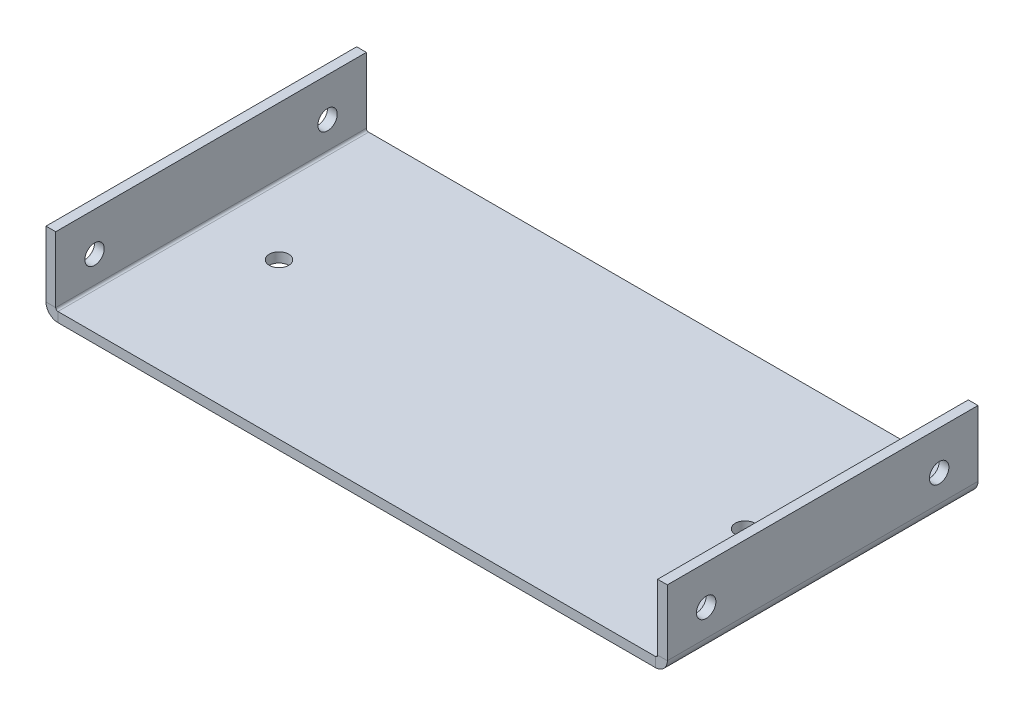
ISO-10303-21;
HEADER;
FILE_DESCRIPTION(('STEP AP214'),'2;1');
FILE_NAME('part.step','',(''),(''),'','','');
FILE_SCHEMA(('AUTOMOTIVE_DESIGN { 1 0 10303 214 1 1 1 1 }'));
ENDSEC;
DATA;
#1=APPLICATION_CONTEXT('core data for automotive mechanical design processes');
#2=APPLICATION_PROTOCOL_DEFINITION('international standard','automotive_design',2000,#1);
#3=PRODUCT_CONTEXT('',#1,'mechanical');
#4=PRODUCT('Part','Part','',(#3));
#5=PRODUCT_RELATED_PRODUCT_CATEGORY('part','',(#4));
#6=PRODUCT_DEFINITION_FORMATION('','',#4);
#7=PRODUCT_DEFINITION_CONTEXT('part definition',#1,'design');
#8=PRODUCT_DEFINITION('design','',#6,#7);
#9=PRODUCT_DEFINITION_SHAPE('','',#8);
#10=(LENGTH_UNIT() NAMED_UNIT(*) SI_UNIT(.MILLI.,.METRE.));
#11=(NAMED_UNIT(*) PLANE_ANGLE_UNIT() SI_UNIT($,.RADIAN.));
#12=(NAMED_UNIT(*) SI_UNIT($,.STERADIAN.) SOLID_ANGLE_UNIT());
#13=UNCERTAINTY_MEASURE_WITH_UNIT(LENGTH_MEASURE(1.E-05),#10,'distance_accuracy_value','');
#14=(GEOMETRIC_REPRESENTATION_CONTEXT(3) GLOBAL_UNCERTAINTY_ASSIGNED_CONTEXT((#13)) GLOBAL_UNIT_ASSIGNED_CONTEXT((#10,
#11,#12)) REPRESENTATION_CONTEXT('',''));
#15=CARTESIAN_POINT('',(0.,0.,0.));
#16=DIRECTION('',(0.,0.,1.));
#17=DIRECTION('',(1.,0.,0.));
#18=AXIS2_PLACEMENT_3D('',#15,#16,#17);
#19=CARTESIAN_POINT('',(0.,3.175,101.6));
#20=DIRECTION('',(0.,-1.,0.));
#21=DIRECTION('',(0.,0.,-1.));
#22=AXIS2_PLACEMENT_3D('',#19,#20,#21);
#23=PLANE('',#22);
#24=CARTESIAN_POINT('',(-25.3999999999999,3.175,50.8));
#25=DIRECTION('',(0.,1.,0.));
#26=DIRECTION('',(0.,0.,1.));
#27=AXIS2_PLACEMENT_3D('',#24,#25,#26);
#28=CIRCLE('',#27,3.175);
#29=CARTESIAN_POINT('',(-25.3999999999999,3.175,53.975));
#30=VERTEX_POINT('',#29);
#31=EDGE_CURVE('E310',#30,#30,#28,.T.);
#32=ORIENTED_EDGE('',*,*,#31,.F.);
#33=EDGE_LOOP('',(#32));
#34=FACE_BOUND('',#33,.T.);
#35=CARTESIAN_POINT('',(-177.8,3.175,50.8));
#36=DIRECTION('',(0.,1.,0.));
#37=DIRECTION('',(0.,0.,1.));
#38=AXIS2_PLACEMENT_3D('',#35,#36,#37);
#39=CIRCLE('',#38,3.175);
#40=CARTESIAN_POINT('',(-177.8,3.175,53.975));
#41=VERTEX_POINT('',#40);
#42=EDGE_CURVE('E300',#41,#41,#39,.T.);
#43=ORIENTED_EDGE('',*,*,#42,.F.);
#44=EDGE_LOOP('',(#43));
#45=FACE_BOUND('',#44,.T.);
#46=DIRECTION('',(0.,0.,-1.));
#47=VECTOR('',#46,1.);
#48=CARTESIAN_POINT('',(-3.9116,3.175,0.));
#49=LINE('',#48,#47);
#50=CARTESIAN_POINT('',(-3.9116,3.175,0.));
#51=VERTEX_POINT('',#50);
#52=CARTESIAN_POINT('',(-3.9116,3.175,101.6));
#53=VERTEX_POINT('',#52);
#54=EDGE_CURVE('E223',#51,#53,#49,.F.);
#55=ORIENTED_EDGE('',*,*,#54,.F.);
#56=DIRECTION('',(1.,0.,0.));
#57=VECTOR('',#56,1.);
#58=CARTESIAN_POINT('',(0.,3.175,0.));
#59=LINE('',#58,#57);
#60=CARTESIAN_POINT('',(-199.2884,3.17500000000001,0.));
#61=VERTEX_POINT('',#60);
#62=EDGE_CURVE('E283',#51,#61,#59,.F.);
#63=ORIENTED_EDGE('',*,*,#62,.T.);
#64=DIRECTION('',(0.,0.,1.));
#65=VECTOR('',#64,1.);
#66=CARTESIAN_POINT('',(-199.2884,3.17500000000001,101.6));
#67=LINE('',#66,#65);
#68=CARTESIAN_POINT('',(-199.2884,3.17500000000001,101.6));
#69=VERTEX_POINT('',#68);
#70=EDGE_CURVE('E275',#69,#61,#67,.F.);
#71=ORIENTED_EDGE('',*,*,#70,.F.);
#72=DIRECTION('',(1.,0.,0.));
#73=VECTOR('',#72,1.);
#74=CARTESIAN_POINT('',(0.,3.175,101.6));
#75=LINE('',#74,#73);
#76=EDGE_CURVE('E87',#53,#69,#75,.F.);
#77=ORIENTED_EDGE('',*,*,#76,.F.);
#78=EDGE_LOOP('',(#55,#63,#71,#77));
#79=FACE_BOUND('',#78,.T.);
#80=ADVANCED_FACE('F79',(#34,#45,#79),#23,.F.);
#81=CARTESIAN_POINT('',(0.,0.,101.6));
#82=DIRECTION('',(0.,-1.,0.));
#83=DIRECTION('',(0.,0.,-1.));
#84=AXIS2_PLACEMENT_3D('',#81,#82,#83);
#85=PLANE('',#84);
#86=CARTESIAN_POINT('',(-25.3999999999999,0.,50.8));
#87=DIRECTION('',(0.,-1.,0.));
#88=DIRECTION('',(0.,0.,-1.));
#89=AXIS2_PLACEMENT_3D('',#86,#87,#88);
#90=CIRCLE('',#89,3.175);
#91=CARTESIAN_POINT('',(-25.3999999999999,0.,47.625));
#92=VERTEX_POINT('',#91);
#93=EDGE_CURVE('E82',#92,#92,#90,.T.);
#94=ORIENTED_EDGE('',*,*,#93,.F.);
#95=EDGE_LOOP('',(#94));
#96=FACE_BOUND('',#95,.T.);
#97=CARTESIAN_POINT('',(-177.8,0.,50.8));
#98=DIRECTION('',(0.,-1.,0.));
#99=DIRECTION('',(0.,0.,-1.));
#100=AXIS2_PLACEMENT_3D('',#97,#98,#99);
#101=CIRCLE('',#100,3.175);
#102=CARTESIAN_POINT('',(-177.8,0.,47.625));
#103=VERTEX_POINT('',#102);
#104=EDGE_CURVE('E297',#103,#103,#101,.T.);
#105=ORIENTED_EDGE('',*,*,#104,.F.);
#106=EDGE_LOOP('',(#105));
#107=FACE_BOUND('',#106,.T.);
#108=DIRECTION('',(-1.,0.,0.));
#109=VECTOR('',#108,1.);
#110=CARTESIAN_POINT('',(0.,0.,0.));
#111=LINE('',#110,#109);
#112=CARTESIAN_POINT('',(-3.9116,0.,0.));
#113=VERTEX_POINT('',#112);
#114=CARTESIAN_POINT('',(-199.2884,0.,0.));
#115=VERTEX_POINT('',#114);
#116=EDGE_CURVE('E103',#113,#115,#111,.T.);
#117=ORIENTED_EDGE('',*,*,#116,.F.);
#118=DIRECTION('',(0.,0.,-1.));
#119=VECTOR('',#118,1.);
#120=CARTESIAN_POINT('',(-3.9116,0.,0.));
#121=LINE('',#120,#119);
#122=CARTESIAN_POINT('',(-3.9116,0.,101.6));
#123=VERTEX_POINT('',#122);
#124=EDGE_CURVE('E212',#113,#123,#121,.F.);
#125=ORIENTED_EDGE('',*,*,#124,.T.);
#126=DIRECTION('',(-1.,0.,0.));
#127=VECTOR('',#126,1.);
#128=CARTESIAN_POINT('',(0.,0.,101.6));
#129=LINE('',#128,#127);
#130=CARTESIAN_POINT('',(-199.2884,0.,101.6));
#131=VERTEX_POINT('',#130);
#132=EDGE_CURVE('E13',#123,#131,#129,.T.);
#133=ORIENTED_EDGE('',*,*,#132,.T.);
#134=DIRECTION('',(0.,0.,1.));
#135=VECTOR('',#134,1.);
#136=CARTESIAN_POINT('',(-199.2884,0.,101.6));
#137=LINE('',#136,#135);
#138=EDGE_CURVE('E262',#131,#115,#137,.F.);
#139=ORIENTED_EDGE('',*,*,#138,.T.);
#140=EDGE_LOOP('',(#117,#125,#133,#139));
#141=FACE_BOUND('',#140,.T.);
#142=ADVANCED_FACE('F349',(#96,#107,#141),#85,.T.);
#143=CARTESIAN_POINT('',(0.,0.,0.));
#144=DIRECTION('',(0.,0.,1.));
#145=DIRECTION('',(1.,0.,0.));
#146=AXIS2_PLACEMENT_3D('',#143,#144,#145);
#147=PLANE('',#146);
#148=DIRECTION('',(0.,-1.,0.));
#149=VECTOR('',#148,1.);
#150=CARTESIAN_POINT('',(-3.9116,3.175,0.));
#151=LINE('',#150,#149);
#152=EDGE_CURVE('E217',#51,#113,#151,.T.);
#153=ORIENTED_EDGE('',*,*,#152,.T.);
#154=ORIENTED_EDGE('',*,*,#116,.T.);
#155=DIRECTION('',(0.,-1.,0.));
#156=VECTOR('',#155,1.);
#157=CARTESIAN_POINT('',(-199.2884,3.17500000000001,0.));
#158=LINE('',#157,#156);
#159=EDGE_CURVE('E280',#61,#115,#158,.T.);
#160=ORIENTED_EDGE('',*,*,#159,.F.);
#161=ORIENTED_EDGE('',*,*,#62,.F.);
#162=EDGE_LOOP('',(#153,#154,#160,#161));
#163=FACE_BOUND('',#162,.T.);
#164=ADVANCED_FACE('F354',(#163),#147,.F.);
#165=CARTESIAN_POINT('',(0.,0.,101.6));
#166=DIRECTION('',(0.,0.,1.));
#167=DIRECTION('',(1.,0.,0.));
#168=AXIS2_PLACEMENT_3D('',#165,#166,#167);
#169=PLANE('',#168);
#170=DIRECTION('',(0.,-1.,0.));
#171=VECTOR('',#170,1.);
#172=CARTESIAN_POINT('',(-3.9116,3.175,101.6));
#173=LINE('',#172,#171);
#174=EDGE_CURVE('E228',#53,#123,#173,.T.);
#175=ORIENTED_EDGE('',*,*,#174,.F.);
#176=ORIENTED_EDGE('',*,*,#76,.T.);
#177=DIRECTION('',(0.,-1.,0.));
#178=VECTOR('',#177,1.);
#179=CARTESIAN_POINT('',(-199.2884,3.17500000000001,101.6));
#180=LINE('',#179,#178);
#181=EDGE_CURVE('E269',#69,#131,#180,.T.);
#182=ORIENTED_EDGE('',*,*,#181,.T.);
#183=ORIENTED_EDGE('',*,*,#132,.F.);
#184=EDGE_LOOP('',(#175,#176,#182,#183));
#185=FACE_BOUND('',#184,.T.);
#186=ADVANCED_FACE('F368',(#185),#169,.T.);
#187=CARTESIAN_POINT('',(-199.2884,3.91160000000002,0.));
#188=DIRECTION('',(0.,0.,-1.));
#189=DIRECTION('',(-1.,0.,0.));
#190=AXIS2_PLACEMENT_3D('',#187,#188,#189);
#191=PLANE('',#190);
#192=DIRECTION('',(1.,0.,0.));
#193=VECTOR('',#192,1.);
#194=CARTESIAN_POINT('',(-203.2,3.9116,0.));
#195=LINE('',#194,#193);
#196=CARTESIAN_POINT('',(-200.025,3.91160000000002,0.));
#197=VERTEX_POINT('',#196);
#198=CARTESIAN_POINT('',(-203.2,3.9116,0.));
#199=VERTEX_POINT('',#198);
#200=EDGE_CURVE('E230',#197,#199,#195,.F.);
#201=ORIENTED_EDGE('',*,*,#200,.F.);
#202=CARTESIAN_POINT('',(-199.2884,3.91160000000002,0.));
#203=DIRECTION('',(0.,0.,1.));
#204=DIRECTION('',(1.,0.,0.));
#205=AXIS2_PLACEMENT_3D('',#202,#203,#204);
#206=CIRCLE('',#205,0.736600000000004);
#207=EDGE_CURVE('E272',#61,#197,#206,.F.);
#208=ORIENTED_EDGE('',*,*,#207,.F.);
#209=ORIENTED_EDGE('',*,*,#159,.T.);
#210=CARTESIAN_POINT('',(-199.2884,3.91160000000002,0.));
#211=DIRECTION('',(0.,0.,1.));
#212=DIRECTION('',(1.,0.,0.));
#213=AXIS2_PLACEMENT_3D('',#210,#211,#212);
#214=CIRCLE('',#213,3.9116);
#215=EDGE_CURVE('E265',#115,#199,#214,.F.);
#216=ORIENTED_EDGE('',*,*,#215,.T.);
#217=EDGE_LOOP('',(#201,#208,#209,#216));
#218=FACE_BOUND('',#217,.T.);
#219=ADVANCED_FACE('F397',(#218),#191,.T.);
#220=CARTESIAN_POINT('',(-199.2884,3.91160000000002,101.6));
#221=DIRECTION('',(0.,0.,-1.));
#222=DIRECTION('',(-1.,0.,0.));
#223=AXIS2_PLACEMENT_3D('',#220,#221,#222);
#224=PLANE('',#223);
#225=CARTESIAN_POINT('',(-199.2884,3.91160000000002,101.6));
#226=DIRECTION('',(0.,0.,1.));
#227=DIRECTION('',(1.,0.,0.));
#228=AXIS2_PLACEMENT_3D('',#225,#226,#227);
#229=CIRCLE('',#228,0.736600000000004);
#230=CARTESIAN_POINT('',(-200.025,3.91160000000002,101.6));
#231=VERTEX_POINT('',#230);
#232=EDGE_CURVE('E235',#231,#69,#229,.T.);
#233=ORIENTED_EDGE('',*,*,#232,.F.);
#234=DIRECTION('',(1.,0.,0.));
#235=VECTOR('',#234,1.);
#236=CARTESIAN_POINT('',(-200.025,3.91160000000002,101.6));
#237=LINE('',#236,#235);
#238=CARTESIAN_POINT('',(-203.2,3.9116,101.6));
#239=VERTEX_POINT('',#238);
#240=EDGE_CURVE('E255',#231,#239,#237,.F.);
#241=ORIENTED_EDGE('',*,*,#240,.T.);
#242=CARTESIAN_POINT('',(-199.2884,3.91160000000002,101.6));
#243=DIRECTION('',(0.,0.,1.));
#244=DIRECTION('',(1.,0.,0.));
#245=AXIS2_PLACEMENT_3D('',#242,#243,#244);
#246=CIRCLE('',#245,3.9116);
#247=EDGE_CURVE('E266',#239,#131,#246,.T.);
#248=ORIENTED_EDGE('',*,*,#247,.T.);
#249=ORIENTED_EDGE('',*,*,#181,.F.);
#250=EDGE_LOOP('',(#233,#241,#248,#249));
#251=FACE_BOUND('',#250,.T.);
#252=ADVANCED_FACE('F376',(#251),#224,.F.);
#253=CARTESIAN_POINT('',(-199.2884,3.91160000000002,101.6));
#254=DIRECTION('',(0.,0.,1.));
#255=DIRECTION('',(-1.,0.,0.));
#256=AXIS2_PLACEMENT_3D('',#253,#254,#255);
#257=CYLINDRICAL_SURFACE('',#256,3.9116);
#258=ORIENTED_EDGE('',*,*,#138,.F.);
#259=ORIENTED_EDGE('',*,*,#247,.F.);
#260=DIRECTION('',(0.,0.,1.));
#261=VECTOR('',#260,1.);
#262=CARTESIAN_POINT('',(-203.2,3.9116,0.));
#263=LINE('',#262,#261);
#264=EDGE_CURVE('E253',#239,#199,#263,.F.);
#265=ORIENTED_EDGE('',*,*,#264,.T.);
#266=ORIENTED_EDGE('',*,*,#215,.F.);
#267=EDGE_LOOP('',(#258,#259,#265,#266));
#268=FACE_BOUND('',#267,.T.);
#269=ADVANCED_FACE('F373',(#268),#257,.T.);
#270=CARTESIAN_POINT('',(-199.2884,3.91160000000002,101.6));
#271=DIRECTION('',(0.,0.,1.));
#272=DIRECTION('',(-1.,0.,0.));
#273=AXIS2_PLACEMENT_3D('',#270,#271,#272);
#274=CYLINDRICAL_SURFACE('',#273,0.736600000000004);
#275=ORIENTED_EDGE('',*,*,#70,.T.);
#276=ORIENTED_EDGE('',*,*,#207,.T.);
#277=DIRECTION('',(0.,0.,1.));
#278=VECTOR('',#277,1.);
#279=CARTESIAN_POINT('',(-200.025,3.91160000000002,0.));
#280=LINE('',#279,#278);
#281=EDGE_CURVE('E258',#197,#231,#280,.T.);
#282=ORIENTED_EDGE('',*,*,#281,.T.);
#283=ORIENTED_EDGE('',*,*,#232,.T.);
#284=EDGE_LOOP('',(#275,#276,#282,#283));
#285=FACE_BOUND('',#284,.T.);
#286=ADVANCED_FACE('F400',(#285),#274,.F.);
#287=CARTESIAN_POINT('',(-203.2,25.4,101.6));
#288=DIRECTION('',(0.,0.,-1.));
#289=DIRECTION('',(-1.,0.,0.));
#290=AXIS2_PLACEMENT_3D('',#287,#288,#289);
#291=PLANE('',#290);
#292=ORIENTED_EDGE('',*,*,#240,.F.);
#293=DIRECTION('',(0.,-1.,0.));
#294=VECTOR('',#293,1.);
#295=CARTESIAN_POINT('',(-200.025,25.4,101.6));
#296=LINE('',#295,#294);
#297=CARTESIAN_POINT('',(-200.025,25.4,101.6));
#298=VERTEX_POINT('',#297);
#299=EDGE_CURVE('E251',#231,#298,#296,.F.);
#300=ORIENTED_EDGE('',*,*,#299,.T.);
#301=DIRECTION('',(1.,0.,0.));
#302=VECTOR('',#301,1.);
#303=CARTESIAN_POINT('',(-203.2,25.4,101.6));
#304=LINE('',#303,#302);
#305=CARTESIAN_POINT('',(-203.2,25.4,101.6));
#306=VERTEX_POINT('',#305);
#307=EDGE_CURVE('E232',#306,#298,#304,.T.);
#308=ORIENTED_EDGE('',*,*,#307,.F.);
#309=DIRECTION('',(0.,1.,0.));
#310=VECTOR('',#309,1.);
#311=CARTESIAN_POINT('',(-203.2,-7.7238124156522E-13,101.6));
#312=LINE('',#311,#310);
#313=EDGE_CURVE('E244',#239,#306,#312,.T.);
#314=ORIENTED_EDGE('',*,*,#313,.F.);
#315=EDGE_LOOP('',(#292,#300,#308,#314));
#316=FACE_BOUND('',#315,.T.);
#317=ADVANCED_FACE('F386',(#316),#291,.F.);
#318=CARTESIAN_POINT('',(-203.2,3.17499999999999,0.));
#319=DIRECTION('',(0.,0.,1.));
#320=DIRECTION('',(1.,0.,0.));
#321=AXIS2_PLACEMENT_3D('',#318,#319,#320);
#322=PLANE('',#321);
#323=ORIENTED_EDGE('',*,*,#200,.T.);
#324=DIRECTION('',(0.,-1.,0.));
#325=VECTOR('',#324,1.);
#326=CARTESIAN_POINT('',(-203.2,-7.7238124156522E-13,0.));
#327=LINE('',#326,#325);
#328=CARTESIAN_POINT('',(-203.2,25.4,0.));
#329=VERTEX_POINT('',#328);
#330=EDGE_CURVE('E239',#329,#199,#327,.T.);
#331=ORIENTED_EDGE('',*,*,#330,.F.);
#332=DIRECTION('',(1.,0.,0.));
#333=VECTOR('',#332,1.);
#334=CARTESIAN_POINT('',(-203.2,25.4,0.));
#335=LINE('',#334,#333);
#336=CARTESIAN_POINT('',(-200.025,25.4,0.));
#337=VERTEX_POINT('',#336);
#338=EDGE_CURVE('E236',#329,#337,#335,.T.);
#339=ORIENTED_EDGE('',*,*,#338,.T.);
#340=DIRECTION('',(0.,1.,0.));
#341=VECTOR('',#340,1.);
#342=CARTESIAN_POINT('',(-200.025,3.175,0.));
#343=LINE('',#342,#341);
#344=EDGE_CURVE('E246',#337,#197,#343,.F.);
#345=ORIENTED_EDGE('',*,*,#344,.T.);
#346=EDGE_LOOP('',(#323,#331,#339,#345));
#347=FACE_BOUND('',#346,.T.);
#348=ADVANCED_FACE('F394',(#347),#322,.F.);
#349=CARTESIAN_POINT('',(-203.2,-7.7238124156522E-13,0.));
#350=DIRECTION('',(1.,0.,0.));
#351=DIRECTION('',(0.,1.,0.));
#352=AXIS2_PLACEMENT_3D('',#349,#350,#351);
#353=PLANE('',#352);
#354=CARTESIAN_POINT('',(-203.2,12.7000000000007,88.9));
#355=DIRECTION('',(1.,0.,0.));
#356=DIRECTION('',(0.,1.,0.));
#357=AXIS2_PLACEMENT_3D('',#354,#355,#356);
#358=CIRCLE('',#357,3.175);
#359=CARTESIAN_POINT('',(-203.2,15.8750000000007,88.9));
#360=VERTEX_POINT('',#359);
#361=EDGE_CURVE('E296',#360,#360,#358,.T.);
#362=ORIENTED_EDGE('',*,*,#361,.T.);
#363=EDGE_LOOP('',(#362));
#364=FACE_BOUND('',#363,.T.);
#365=CARTESIAN_POINT('',(-203.2,12.7000000000007,12.7));
#366=DIRECTION('',(1.,0.,0.));
#367=DIRECTION('',(0.,1.,0.));
#368=AXIS2_PLACEMENT_3D('',#365,#366,#367);
#369=CIRCLE('',#368,3.175);
#370=CARTESIAN_POINT('',(-203.2,15.8750000000007,12.7));
#371=VERTEX_POINT('',#370);
#372=EDGE_CURVE('E292',#371,#371,#369,.T.);
#373=ORIENTED_EDGE('',*,*,#372,.T.);
#374=EDGE_LOOP('',(#373));
#375=FACE_BOUND('',#374,.T.);
#376=ORIENTED_EDGE('',*,*,#264,.F.);
#377=ORIENTED_EDGE('',*,*,#313,.T.);
#378=DIRECTION('',(0.,0.,-1.));
#379=VECTOR('',#378,1.);
#380=CARTESIAN_POINT('',(-203.2,25.4,0.));
#381=LINE('',#380,#379);
#382=EDGE_CURVE('E242',#306,#329,#381,.T.);
#383=ORIENTED_EDGE('',*,*,#382,.T.);
#384=ORIENTED_EDGE('',*,*,#330,.T.);
#385=EDGE_LOOP('',(#376,#377,#383,#384));
#386=FACE_BOUND('',#385,.T.);
#387=ADVANCED_FACE('F383',(#364,#375,#386),#353,.F.);
#388=CARTESIAN_POINT('',(-200.025,-7.61295788314393E-13,0.));
#389=DIRECTION('',(1.,0.,0.));
#390=DIRECTION('',(0.,1.,0.));
#391=AXIS2_PLACEMENT_3D('',#388,#389,#390);
#392=PLANE('',#391);
#393=CARTESIAN_POINT('',(-200.025,12.7000000000007,88.9));
#394=DIRECTION('',(1.,0.,0.));
#395=DIRECTION('',(0.,1.,0.));
#396=AXIS2_PLACEMENT_3D('',#393,#394,#395);
#397=CIRCLE('',#396,3.175);
#398=CARTESIAN_POINT('',(-200.025,15.8750000000007,88.9));
#399=VERTEX_POINT('',#398);
#400=EDGE_CURVE('E295',#399,#399,#397,.T.);
#401=ORIENTED_EDGE('',*,*,#400,.F.);
#402=EDGE_LOOP('',(#401));
#403=FACE_BOUND('',#402,.T.);
#404=CARTESIAN_POINT('',(-200.025,12.7000000000007,12.7));
#405=DIRECTION('',(1.,0.,0.));
#406=DIRECTION('',(0.,1.,0.));
#407=AXIS2_PLACEMENT_3D('',#404,#405,#406);
#408=CIRCLE('',#407,3.175);
#409=CARTESIAN_POINT('',(-200.025,15.8750000000007,12.7));
#410=VERTEX_POINT('',#409);
#411=EDGE_CURVE('E211',#410,#410,#408,.T.);
#412=ORIENTED_EDGE('',*,*,#411,.F.);
#413=EDGE_LOOP('',(#412));
#414=FACE_BOUND('',#413,.T.);
#415=ORIENTED_EDGE('',*,*,#299,.F.);
#416=ORIENTED_EDGE('',*,*,#281,.F.);
#417=ORIENTED_EDGE('',*,*,#344,.F.);
#418=DIRECTION('',(0.,0.,1.));
#419=VECTOR('',#418,1.);
#420=CARTESIAN_POINT('',(-200.025,25.4,0.));
#421=LINE('',#420,#419);
#422=EDGE_CURVE('E249',#298,#337,#421,.F.);
#423=ORIENTED_EDGE('',*,*,#422,.F.);
#424=EDGE_LOOP('',(#415,#416,#417,#423));
#425=FACE_BOUND('',#424,.T.);
#426=ADVANCED_FACE('F402',(#403,#414,#425),#392,.T.);
#427=CARTESIAN_POINT('',(-203.2,25.4,0.));
#428=DIRECTION('',(0.,-1.,0.));
#429=DIRECTION('',(1.,0.,0.));
#430=AXIS2_PLACEMENT_3D('',#427,#428,#429);
#431=PLANE('',#430);
#432=ORIENTED_EDGE('',*,*,#422,.T.);
#433=ORIENTED_EDGE('',*,*,#338,.F.);
#434=ORIENTED_EDGE('',*,*,#382,.F.);
#435=ORIENTED_EDGE('',*,*,#307,.T.);
#436=EDGE_LOOP('',(#432,#433,#434,#435));
#437=FACE_BOUND('',#436,.T.);
#438=ADVANCED_FACE('F391',(#437),#431,.F.);
#439=CARTESIAN_POINT('',(-3.9116,3.9116,101.6));
#440=DIRECTION('',(0.,0.,1.));
#441=DIRECTION('',(1.,0.,0.));
#442=AXIS2_PLACEMENT_3D('',#439,#440,#441);
#443=PLANE('',#442);
#444=DIRECTION('',(-1.,0.,0.));
#445=VECTOR('',#444,1.);
#446=CARTESIAN_POINT('',(0.,3.91159999999999,101.6));
#447=LINE('',#446,#445);
#448=CARTESIAN_POINT('',(-3.175,3.9116,101.6));
#449=VERTEX_POINT('',#448);
#450=CARTESIAN_POINT('',(0.,3.91159999999999,101.6));
#451=VERTEX_POINT('',#450);
#452=EDGE_CURVE('E194',#449,#451,#447,.F.);
#453=ORIENTED_EDGE('',*,*,#452,.F.);
#454=CARTESIAN_POINT('',(-3.9116,3.9116,101.6));
#455=DIRECTION('',(0.,0.,-1.));
#456=DIRECTION('',(-1.,0.,0.));
#457=AXIS2_PLACEMENT_3D('',#454,#455,#456);
#458=CIRCLE('',#457,0.7366);
#459=EDGE_CURVE('E220',#53,#449,#458,.F.);
#460=ORIENTED_EDGE('',*,*,#459,.F.);
#461=ORIENTED_EDGE('',*,*,#174,.T.);
#462=CARTESIAN_POINT('',(-3.9116,3.9116,101.6));
#463=DIRECTION('',(0.,0.,-1.));
#464=DIRECTION('',(-1.,0.,0.));
#465=AXIS2_PLACEMENT_3D('',#462,#463,#464);
#466=CIRCLE('',#465,3.9116);
#467=EDGE_CURVE('E95',#123,#451,#466,.F.);
#468=ORIENTED_EDGE('',*,*,#467,.T.);
#469=EDGE_LOOP('',(#453,#460,#461,#468));
#470=FACE_BOUND('',#469,.T.);
#471=ADVANCED_FACE('F365',(#470),#443,.T.);
#472=CARTESIAN_POINT('',(-3.9116,3.9116,0.));
#473=DIRECTION('',(0.,0.,1.));
#474=DIRECTION('',(1.,0.,0.));
#475=AXIS2_PLACEMENT_3D('',#472,#473,#474);
#476=PLANE('',#475);
#477=CARTESIAN_POINT('',(-3.9116,3.9116,0.));
#478=DIRECTION('',(0.,0.,-1.));
#479=DIRECTION('',(-1.,0.,0.));
#480=AXIS2_PLACEMENT_3D('',#477,#478,#479);
#481=CIRCLE('',#480,0.7366);
#482=CARTESIAN_POINT('',(-3.175,3.9116,0.));
#483=VERTEX_POINT('',#482);
#484=EDGE_CURVE('E225',#483,#51,#481,.T.);
#485=ORIENTED_EDGE('',*,*,#484,.F.);
#486=DIRECTION('',(-1.,0.,0.));
#487=VECTOR('',#486,1.);
#488=CARTESIAN_POINT('',(-3.175,3.9116,0.));
#489=LINE('',#488,#487);
#490=CARTESIAN_POINT('',(0.,3.91159999999999,0.));
#491=VERTEX_POINT('',#490);
#492=EDGE_CURVE('E205',#483,#491,#489,.F.);
#493=ORIENTED_EDGE('',*,*,#492,.T.);
#494=CARTESIAN_POINT('',(-3.9116,3.9116,0.));
#495=DIRECTION('',(0.,0.,-1.));
#496=DIRECTION('',(-1.,0.,0.));
#497=AXIS2_PLACEMENT_3D('',#494,#495,#496);
#498=CIRCLE('',#497,3.9116);
#499=EDGE_CURVE('E215',#491,#113,#498,.T.);
#500=ORIENTED_EDGE('',*,*,#499,.T.);
#501=ORIENTED_EDGE('',*,*,#152,.F.);
#502=EDGE_LOOP('',(#485,#493,#500,#501));
#503=FACE_BOUND('',#502,.T.);
#504=ADVANCED_FACE('F336',(#503),#476,.F.);
#505=CARTESIAN_POINT('',(-3.9116,3.9116,0.));
#506=DIRECTION('',(0.,0.,-1.));
#507=DIRECTION('',(1.,0.,0.));
#508=AXIS2_PLACEMENT_3D('',#505,#506,#507);
#509=CYLINDRICAL_SURFACE('',#508,3.9116);
#510=ORIENTED_EDGE('',*,*,#124,.F.);
#511=ORIENTED_EDGE('',*,*,#499,.F.);
#512=DIRECTION('',(0.,0.,-1.));
#513=VECTOR('',#512,1.);
#514=CARTESIAN_POINT('',(0.,3.91159999999999,101.6));
#515=LINE('',#514,#513);
#516=EDGE_CURVE('E203',#491,#451,#515,.F.);
#517=ORIENTED_EDGE('',*,*,#516,.T.);
#518=ORIENTED_EDGE('',*,*,#467,.F.);
#519=EDGE_LOOP('',(#510,#511,#517,#518));
#520=FACE_BOUND('',#519,.T.);
#521=ADVANCED_FACE('F604',(#520),#509,.T.);
#522=CARTESIAN_POINT('',(-3.9116,3.9116,0.));
#523=DIRECTION('',(0.,0.,-1.));
#524=DIRECTION('',(1.,0.,0.));
#525=AXIS2_PLACEMENT_3D('',#522,#523,#524);
#526=CYLINDRICAL_SURFACE('',#525,0.7366);
#527=ORIENTED_EDGE('',*,*,#54,.T.);
#528=ORIENTED_EDGE('',*,*,#459,.T.);
#529=DIRECTION('',(0.,0.,-1.));
#530=VECTOR('',#529,1.);
#531=CARTESIAN_POINT('',(-3.175,3.9116,101.6));
#532=LINE('',#531,#530);
#533=EDGE_CURVE('E208',#449,#483,#532,.T.);
#534=ORIENTED_EDGE('',*,*,#533,.T.);
#535=ORIENTED_EDGE('',*,*,#484,.T.);
#536=EDGE_LOOP('',(#527,#528,#534,#535));
#537=FACE_BOUND('',#536,.T.);
#538=ADVANCED_FACE('F331',(#537),#526,.F.);
#539=CARTESIAN_POINT('',(0.,3.17499999999999,101.6));
#540=DIRECTION('',(0.,0.,-1.));
#541=DIRECTION('',(-1.,0.,0.));
#542=AXIS2_PLACEMENT_3D('',#539,#540,#541);
#543=PLANE('',#542);
#544=ORIENTED_EDGE('',*,*,#452,.T.);
#545=DIRECTION('',(0.,-1.,0.));
#546=VECTOR('',#545,1.);
#547=CARTESIAN_POINT('',(0.,0.,101.6));
#548=LINE('',#547,#546);
#549=CARTESIAN_POINT('',(0.,25.4,101.6));
#550=VERTEX_POINT('',#549);
#551=EDGE_CURVE('E175',#550,#451,#548,.T.);
#552=ORIENTED_EDGE('',*,*,#551,.F.);
#553=DIRECTION('',(-1.,0.,0.));
#554=VECTOR('',#553,1.);
#555=CARTESIAN_POINT('',(0.,25.4,101.6));
#556=LINE('',#555,#554);
#557=CARTESIAN_POINT('',(-3.17499999999992,25.4,101.6));
#558=VERTEX_POINT('',#557);
#559=EDGE_CURVE('E181',#550,#558,#556,.T.);
#560=ORIENTED_EDGE('',*,*,#559,.T.);
#561=DIRECTION('',(0.,1.,0.));
#562=VECTOR('',#561,1.);
#563=CARTESIAN_POINT('',(-3.175,3.175,101.6));
#564=LINE('',#563,#562);
#565=EDGE_CURVE('E201',#558,#449,#564,.F.);
#566=ORIENTED_EDGE('',*,*,#565,.T.);
#567=EDGE_LOOP('',(#544,#552,#560,#566));
#568=FACE_BOUND('',#567,.T.);
#569=ADVANCED_FACE('F193',(#568),#543,.F.);
#570=CARTESIAN_POINT('',(0.,25.4,0.));
#571=DIRECTION('',(0.,0.,1.));
#572=DIRECTION('',(1.,0.,0.));
#573=AXIS2_PLACEMENT_3D('',#570,#571,#572);
#574=PLANE('',#573);
#575=ORIENTED_EDGE('',*,*,#492,.F.);
#576=DIRECTION('',(0.,-1.,0.));
#577=VECTOR('',#576,1.);
#578=CARTESIAN_POINT('',(-3.17499999999992,25.4,0.));
#579=LINE('',#578,#577);
#580=CARTESIAN_POINT('',(-3.17499999999992,25.4,0.));
#581=VERTEX_POINT('',#580);
#582=EDGE_CURVE('E197',#483,#581,#579,.F.);
#583=ORIENTED_EDGE('',*,*,#582,.T.);
#584=DIRECTION('',(-1.,0.,0.));
#585=VECTOR('',#584,1.);
#586=CARTESIAN_POINT('',(0.,25.4,0.));
#587=LINE('',#586,#585);
#588=CARTESIAN_POINT('',(0.,25.4,0.));
#589=VERTEX_POINT('',#588);
#590=EDGE_CURVE('E190',#589,#581,#587,.T.);
#591=ORIENTED_EDGE('',*,*,#590,.F.);
#592=DIRECTION('',(0.,1.,0.));
#593=VECTOR('',#592,1.);
#594=CARTESIAN_POINT('',(0.,0.,0.));
#595=LINE('',#594,#593);
#596=EDGE_CURVE('E177',#491,#589,#595,.T.);
#597=ORIENTED_EDGE('',*,*,#596,.F.);
#598=EDGE_LOOP('',(#575,#583,#591,#597));
#599=FACE_BOUND('',#598,.T.);
#600=ADVANCED_FACE('F337',(#599),#574,.F.);
#601=CARTESIAN_POINT('',(0.,0.,0.));
#602=DIRECTION('',(-1.,0.,0.));
#603=DIRECTION('',(0.,-1.,0.));
#604=AXIS2_PLACEMENT_3D('',#601,#602,#603);
#605=PLANE('',#604);
#606=CARTESIAN_POINT('',(0.,12.7,88.9));
#607=DIRECTION('',(1.,0.,0.));
#608=DIRECTION('',(0.,1.,0.));
#609=AXIS2_PLACEMENT_3D('',#606,#607,#608);
#610=CIRCLE('',#609,3.175);
#611=CARTESIAN_POINT('',(0.,15.875,88.9));
#612=VERTEX_POINT('',#611);
#613=EDGE_CURVE('E299',#612,#612,#610,.T.);
#614=ORIENTED_EDGE('',*,*,#613,.F.);
#615=EDGE_LOOP('',(#614));
#616=FACE_BOUND('',#615,.T.);
#617=CARTESIAN_POINT('',(0.,12.7,12.7));
#618=DIRECTION('',(1.,0.,0.));
#619=DIRECTION('',(0.,1.,0.));
#620=AXIS2_PLACEMENT_3D('',#617,#618,#619);
#621=CIRCLE('',#620,3.175);
#622=CARTESIAN_POINT('',(0.,15.875,12.7));
#623=VERTEX_POINT('',#622);
#624=EDGE_CURVE('E317',#623,#623,#621,.T.);
#625=ORIENTED_EDGE('',*,*,#624,.F.);
#626=EDGE_LOOP('',(#625));
#627=FACE_BOUND('',#626,.T.);
#628=ORIENTED_EDGE('',*,*,#516,.F.);
#629=ORIENTED_EDGE('',*,*,#596,.T.);
#630=DIRECTION('',(0.,0.,1.));
#631=VECTOR('',#630,1.);
#632=CARTESIAN_POINT('',(0.,25.4,0.));
#633=LINE('',#632,#631);
#634=EDGE_CURVE('E170',#589,#550,#633,.T.);
#635=ORIENTED_EDGE('',*,*,#634,.T.);
#636=ORIENTED_EDGE('',*,*,#551,.T.);
#637=EDGE_LOOP('',(#628,#629,#635,#636));
#638=FACE_BOUND('',#637,.T.);
#639=ADVANCED_FACE('F173',(#616,#627,#638),#605,.F.);
#640=CARTESIAN_POINT('',(-3.17500000000001,0.,0.));
#641=DIRECTION('',(-1.,0.,0.));
#642=DIRECTION('',(0.,-1.,0.));
#643=AXIS2_PLACEMENT_3D('',#640,#641,#642);
#644=PLANE('',#643);
#645=CARTESIAN_POINT('',(-3.17499999999996,12.7,88.9));
#646=DIRECTION('',(-1.,0.,0.));
#647=DIRECTION('',(0.,-1.,0.));
#648=AXIS2_PLACEMENT_3D('',#645,#646,#647);
#649=CIRCLE('',#648,3.175);
#650=CARTESIAN_POINT('',(-3.17499999999997,9.52500000000001,88.9));
#651=VERTEX_POINT('',#650);
#652=EDGE_CURVE('E293',#651,#651,#649,.T.);
#653=ORIENTED_EDGE('',*,*,#652,.F.);
#654=EDGE_LOOP('',(#653));
#655=FACE_BOUND('',#654,.T.);
#656=CARTESIAN_POINT('',(-3.17499999999996,12.7,12.7));
#657=DIRECTION('',(-1.,0.,0.));
#658=DIRECTION('',(0.,-1.,0.));
#659=AXIS2_PLACEMENT_3D('',#656,#657,#658);
#660=CIRCLE('',#659,3.175);
#661=CARTESIAN_POINT('',(-3.17499999999997,9.52500000000001,12.7));
#662=VERTEX_POINT('',#661);
#663=EDGE_CURVE('E289',#662,#662,#660,.T.);
#664=ORIENTED_EDGE('',*,*,#663,.F.);
#665=EDGE_LOOP('',(#664));
#666=FACE_BOUND('',#665,.T.);
#667=ORIENTED_EDGE('',*,*,#582,.F.);
#668=ORIENTED_EDGE('',*,*,#533,.F.);
#669=ORIENTED_EDGE('',*,*,#565,.F.);
#670=DIRECTION('',(0.,0.,-1.));
#671=VECTOR('',#670,1.);
#672=CARTESIAN_POINT('',(-3.17499999999992,25.4,101.6));
#673=LINE('',#672,#671);
#674=EDGE_CURVE('E186',#581,#558,#673,.F.);
#675=ORIENTED_EDGE('',*,*,#674,.F.);
#676=EDGE_LOOP('',(#667,#668,#669,#675));
#677=FACE_BOUND('',#676,.T.);
#678=ADVANCED_FACE('F327',(#655,#666,#677),#644,.T.);
#679=CARTESIAN_POINT('',(0.,25.4,101.6));
#680=DIRECTION('',(0.,-1.,0.));
#681=DIRECTION('',(1.,0.,0.));
#682=AXIS2_PLACEMENT_3D('',#679,#680,#681);
#683=PLANE('',#682);
#684=ORIENTED_EDGE('',*,*,#674,.T.);
#685=ORIENTED_EDGE('',*,*,#559,.F.);
#686=ORIENTED_EDGE('',*,*,#634,.F.);
#687=ORIENTED_EDGE('',*,*,#590,.T.);
#688=EDGE_LOOP('',(#684,#685,#686,#687));
#689=FACE_BOUND('',#688,.T.);
#690=ADVANCED_FACE('F184',(#689),#683,.F.);
#691=CARTESIAN_POINT('',(-203.2,12.7000000000007,12.7));
#692=DIRECTION('',(1.,0.,0.));
#693=DIRECTION('',(0.,1.,0.));
#694=AXIS2_PLACEMENT_3D('',#691,#692,#693);
#695=CYLINDRICAL_SURFACE('',#694,3.175);
#696=ORIENTED_EDGE('',*,*,#663,.T.);
#697=EDGE_LOOP('',(#696));
#698=FACE_BOUND('',#697,.T.);
#699=ORIENTED_EDGE('',*,*,#624,.T.);
#700=EDGE_LOOP('',(#699));
#701=FACE_BOUND('',#700,.T.);
#702=ADVANCED_FACE('F504',(#698,#701),#695,.F.);
#703=ORIENTED_EDGE('',*,*,#411,.T.);
#704=EDGE_LOOP('',(#703));
#705=FACE_BOUND('',#704,.T.);
#706=ORIENTED_EDGE('',*,*,#372,.F.);
#707=EDGE_LOOP('',(#706));
#708=FACE_BOUND('',#707,.T.);
#709=ADVANCED_FACE('F509',(#705,#708),#695,.F.);
#710=CARTESIAN_POINT('',(-203.2,12.7000000000007,88.9));
#711=DIRECTION('',(1.,0.,0.));
#712=DIRECTION('',(0.,1.,0.));
#713=AXIS2_PLACEMENT_3D('',#710,#711,#712);
#714=CYLINDRICAL_SURFACE('',#713,3.175);
#715=ORIENTED_EDGE('',*,*,#652,.T.);
#716=EDGE_LOOP('',(#715));
#717=FACE_BOUND('',#716,.T.);
#718=ORIENTED_EDGE('',*,*,#613,.T.);
#719=EDGE_LOOP('',(#718));
#720=FACE_BOUND('',#719,.T.);
#721=ADVANCED_FACE('F520',(#717,#720),#714,.F.);
#722=ORIENTED_EDGE('',*,*,#400,.T.);
#723=EDGE_LOOP('',(#722));
#724=FACE_BOUND('',#723,.T.);
#725=ORIENTED_EDGE('',*,*,#361,.F.);
#726=EDGE_LOOP('',(#725));
#727=FACE_BOUND('',#726,.T.);
#728=ADVANCED_FACE('F530',(#724,#727),#714,.F.);
#729=CARTESIAN_POINT('',(-177.8,-9.525,50.8));
#730=DIRECTION('',(0.,1.,0.));
#731=DIRECTION('',(0.,0.,1.));
#732=AXIS2_PLACEMENT_3D('',#729,#730,#731);
#733=CYLINDRICAL_SURFACE('',#732,3.175);
#734=ORIENTED_EDGE('',*,*,#104,.T.);
#735=EDGE_LOOP('',(#734));
#736=FACE_BOUND('',#735,.T.);
#737=ORIENTED_EDGE('',*,*,#42,.T.);
#738=EDGE_LOOP('',(#737));
#739=FACE_BOUND('',#738,.T.);
#740=ADVANCED_FACE('F540',(#736,#739),#733,.F.);
#741=CARTESIAN_POINT('',(-25.3999999999999,-9.525,50.8));
#742=DIRECTION('',(0.,1.,0.));
#743=DIRECTION('',(0.,0.,1.));
#744=AXIS2_PLACEMENT_3D('',#741,#742,#743);
#745=CYLINDRICAL_SURFACE('',#744,3.175);
#746=ORIENTED_EDGE('',*,*,#93,.T.);
#747=EDGE_LOOP('',(#746));
#748=FACE_BOUND('',#747,.T.);
#749=ORIENTED_EDGE('',*,*,#31,.T.);
#750=EDGE_LOOP('',(#749));
#751=FACE_BOUND('',#750,.T.);
#752=ADVANCED_FACE('F562',(#748,#751),#745,.F.);
#753=CLOSED_SHELL('',(#80,#142,#164,#186,#219,#252,#269,#286,#317,#348,#387,#426,#438,#471,#504,
#521,#538,#569,#600,#639,#678,#690,#702,#709,#721,#728,#740,#752));
#754=MANIFOLD_SOLID_BREP('B2',#753);
#755=ADVANCED_BREP_SHAPE_REPRESENTATION('',(#18,#754),#14);
#756=SHAPE_DEFINITION_REPRESENTATION(#9,#755);
ENDSEC;
END-ISO-10303-21;
